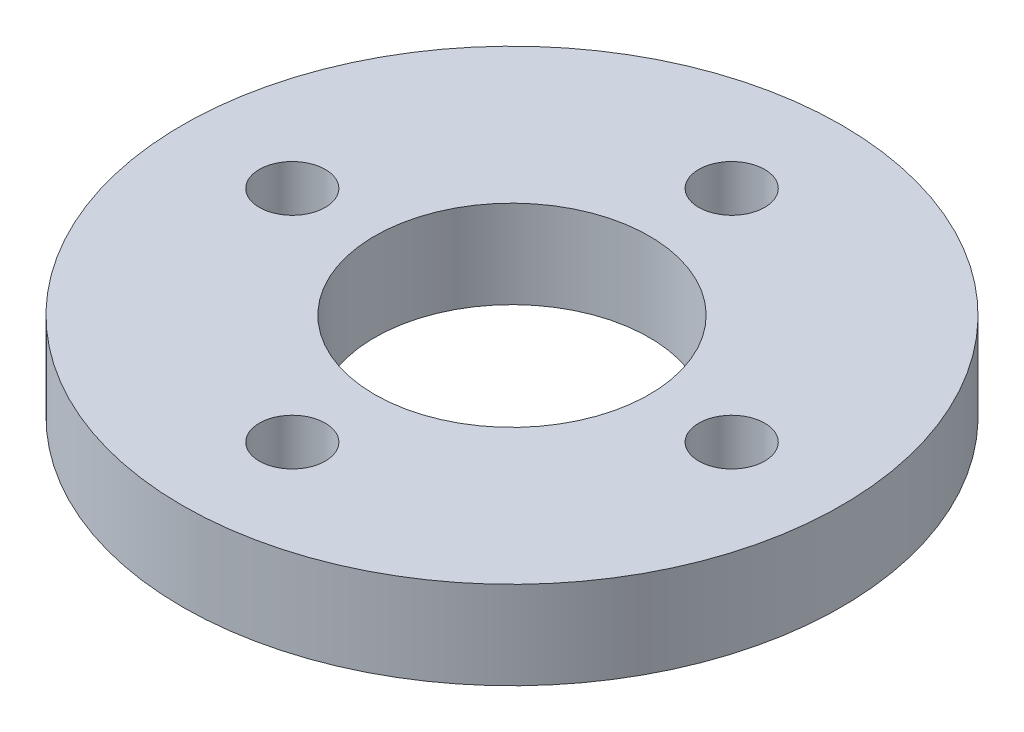
ISO-10303-21;
HEADER;
FILE_DESCRIPTION(('STEP AP214'),'2;1');
FILE_NAME('part.step','',(''),(''),'','','');
FILE_SCHEMA(('AUTOMOTIVE_DESIGN { 1 0 10303 214 1 1 1 1 }'));
ENDSEC;
DATA;
#1=APPLICATION_CONTEXT('core data for automotive mechanical design processes');
#2=APPLICATION_PROTOCOL_DEFINITION('international standard','automotive_design',2000,#1);
#3=PRODUCT_CONTEXT('',#1,'mechanical');
#4=PRODUCT('Part','Part','',(#3));
#5=PRODUCT_RELATED_PRODUCT_CATEGORY('part','',(#4));
#6=PRODUCT_DEFINITION_FORMATION('','',#4);
#7=PRODUCT_DEFINITION_CONTEXT('part definition',#1,'design');
#8=PRODUCT_DEFINITION('design','',#6,#7);
#9=PRODUCT_DEFINITION_SHAPE('','',#8);
#10=(LENGTH_UNIT() NAMED_UNIT(*) SI_UNIT(.MILLI.,.METRE.));
#11=(NAMED_UNIT(*) PLANE_ANGLE_UNIT() SI_UNIT($,.RADIAN.));
#12=(NAMED_UNIT(*) SI_UNIT($,.STERADIAN.) SOLID_ANGLE_UNIT());
#13=UNCERTAINTY_MEASURE_WITH_UNIT(LENGTH_MEASURE(1.E-05),#10,'distance_accuracy_value','');
#14=(GEOMETRIC_REPRESENTATION_CONTEXT(3) GLOBAL_UNCERTAINTY_ASSIGNED_CONTEXT((#13)) GLOBAL_UNIT_ASSIGNED_CONTEXT((#10,
#11,#12)) REPRESENTATION_CONTEXT('',''));
#15=CARTESIAN_POINT('',(0.,0.,0.));
#16=DIRECTION('',(0.,0.,1.));
#17=DIRECTION('',(1.,0.,0.));
#18=AXIS2_PLACEMENT_3D('',#15,#16,#17);
#19=CARTESIAN_POINT('',(0.,4.,0.));
#20=DIRECTION('',(0.,1.,0.));
#21=DIRECTION('',(0.,0.,1.));
#22=AXIS2_PLACEMENT_3D('',#19,#20,#21);
#23=PLANE('',#22);
#24=CARTESIAN_POINT('',(0.,4.,10.));
#25=DIRECTION('',(0.,1.,0.));
#26=DIRECTION('',(0.,0.,1.));
#27=AXIS2_PLACEMENT_3D('',#24,#25,#26);
#28=CIRCLE('',#27,1.5);
#29=CARTESIAN_POINT('',(0.,4.,11.5));
#30=VERTEX_POINT('',#29);
#31=EDGE_CURVE('E64',#30,#30,#28,.T.);
#32=ORIENTED_EDGE('',*,*,#31,.F.);
#33=EDGE_LOOP('',(#32));
#34=FACE_BOUND('',#33,.T.);
#35=CARTESIAN_POINT('',(0.,4.,-10.));
#36=DIRECTION('',(0.,1.,0.));
#37=DIRECTION('',(0.,0.,1.));
#38=AXIS2_PLACEMENT_3D('',#35,#36,#37);
#39=CIRCLE('',#38,1.5);
#40=CARTESIAN_POINT('',(0.,4.,-8.5));
#41=VERTEX_POINT('',#40);
#42=EDGE_CURVE('E52',#41,#41,#39,.T.);
#43=ORIENTED_EDGE('',*,*,#42,.F.);
#44=EDGE_LOOP('',(#43));
#45=FACE_BOUND('',#44,.T.);
#46=CARTESIAN_POINT('',(0.,4.,0.));
#47=DIRECTION('',(0.,1.,0.));
#48=DIRECTION('',(0.,0.,1.));
#49=AXIS2_PLACEMENT_3D('',#46,#47,#48);
#50=CIRCLE('',#49,15.);
#51=CARTESIAN_POINT('',(0.,4.,15.));
#52=VERTEX_POINT('',#51);
#53=EDGE_CURVE('E10',#52,#52,#50,.T.);
#54=ORIENTED_EDGE('',*,*,#53,.T.);
#55=EDGE_LOOP('',(#54));
#56=FACE_BOUND('',#55,.T.);
#57=CARTESIAN_POINT('',(0.,4.,0.));
#58=DIRECTION('',(0.,1.,0.));
#59=DIRECTION('',(0.,0.,1.));
#60=AXIS2_PLACEMENT_3D('',#57,#58,#59);
#61=CIRCLE('',#60,6.25);
#62=CARTESIAN_POINT('',(0.,4.,6.25));
#63=VERTEX_POINT('',#62);
#64=EDGE_CURVE('E47',#63,#63,#61,.T.);
#65=ORIENTED_EDGE('',*,*,#64,.F.);
#66=EDGE_LOOP('',(#65));
#67=FACE_BOUND('',#66,.T.);
#68=CARTESIAN_POINT('',(10.,4.,0.));
#69=DIRECTION('',(0.,1.,0.));
#70=DIRECTION('',(0.,0.,1.));
#71=AXIS2_PLACEMENT_3D('',#68,#69,#70);
#72=CIRCLE('',#71,1.5);
#73=CARTESIAN_POINT('',(10.,4.,1.50000000000003));
#74=VERTEX_POINT('',#73);
#75=EDGE_CURVE('E58',#74,#74,#72,.T.);
#76=ORIENTED_EDGE('',*,*,#75,.F.);
#77=EDGE_LOOP('',(#76));
#78=FACE_BOUND('',#77,.T.);
#79=CARTESIAN_POINT('',(-10.,4.,-1.04744440165294E-13));
#80=DIRECTION('',(0.,1.,0.));
#81=DIRECTION('',(0.,0.,1.));
#82=AXIS2_PLACEMENT_3D('',#79,#80,#81);
#83=CIRCLE('',#82,1.5);
#84=CARTESIAN_POINT('',(-10.,4.,1.49999999999989));
#85=VERTEX_POINT('',#84);
#86=EDGE_CURVE('E70',#85,#85,#83,.T.);
#87=ORIENTED_EDGE('',*,*,#86,.F.);
#88=EDGE_LOOP('',(#87));
#89=FACE_BOUND('',#88,.T.);
#90=ADVANCED_FACE('F36',(#34,#45,#56,#67,#78,#89),#23,.T.);
#91=CARTESIAN_POINT('',(0.,0.,0.));
#92=DIRECTION('',(0.,1.,0.));
#93=DIRECTION('',(0.,0.,1.));
#94=AXIS2_PLACEMENT_3D('',#91,#92,#93);
#95=PLANE('',#94);
#96=CARTESIAN_POINT('',(0.,0.,0.));
#97=DIRECTION('',(0.,1.,0.));
#98=DIRECTION('',(0.,0.,1.));
#99=AXIS2_PLACEMENT_3D('',#96,#97,#98);
#100=CIRCLE('',#99,15.);
#101=CARTESIAN_POINT('',(0.,0.,15.));
#102=VERTEX_POINT('',#101);
#103=EDGE_CURVE('E40',#102,#102,#100,.T.);
#104=ORIENTED_EDGE('',*,*,#103,.F.);
#105=EDGE_LOOP('',(#104));
#106=FACE_BOUND('',#105,.T.);
#107=CARTESIAN_POINT('',(0.,0.,0.));
#108=DIRECTION('',(0.,1.,0.));
#109=DIRECTION('',(0.,0.,1.));
#110=AXIS2_PLACEMENT_3D('',#107,#108,#109);
#111=CIRCLE('',#110,6.25);
#112=CARTESIAN_POINT('',(0.,0.,6.25));
#113=VERTEX_POINT('',#112);
#114=EDGE_CURVE('E49',#113,#113,#111,.T.);
#115=ORIENTED_EDGE('',*,*,#114,.T.);
#116=EDGE_LOOP('',(#115));
#117=FACE_BOUND('',#116,.T.);
#118=CARTESIAN_POINT('',(0.,0.,-10.));
#119=DIRECTION('',(0.,1.,0.));
#120=DIRECTION('',(0.,0.,1.));
#121=AXIS2_PLACEMENT_3D('',#118,#119,#120);
#122=CIRCLE('',#121,1.5);
#123=CARTESIAN_POINT('',(0.,0.,-8.5));
#124=VERTEX_POINT('',#123);
#125=EDGE_CURVE('E55',#124,#124,#122,.T.);
#126=ORIENTED_EDGE('',*,*,#125,.T.);
#127=EDGE_LOOP('',(#126));
#128=FACE_BOUND('',#127,.T.);
#129=CARTESIAN_POINT('',(10.,0.,0.));
#130=DIRECTION('',(0.,1.,0.));
#131=DIRECTION('',(0.,0.,1.));
#132=AXIS2_PLACEMENT_3D('',#129,#130,#131);
#133=CIRCLE('',#132,1.5);
#134=CARTESIAN_POINT('',(10.,0.,1.50000000000003));
#135=VERTEX_POINT('',#134);
#136=EDGE_CURVE('E61',#135,#135,#133,.T.);
#137=ORIENTED_EDGE('',*,*,#136,.T.);
#138=EDGE_LOOP('',(#137));
#139=FACE_BOUND('',#138,.T.);
#140=CARTESIAN_POINT('',(0.,0.,10.));
#141=DIRECTION('',(0.,1.,0.));
#142=DIRECTION('',(0.,0.,1.));
#143=AXIS2_PLACEMENT_3D('',#140,#141,#142);
#144=CIRCLE('',#143,1.5);
#145=CARTESIAN_POINT('',(0.,0.,11.5));
#146=VERTEX_POINT('',#145);
#147=EDGE_CURVE('E67',#146,#146,#144,.T.);
#148=ORIENTED_EDGE('',*,*,#147,.T.);
#149=EDGE_LOOP('',(#148));
#150=FACE_BOUND('',#149,.T.);
#151=CARTESIAN_POINT('',(-10.,0.,-1.04744440165294E-13));
#152=DIRECTION('',(0.,1.,0.));
#153=DIRECTION('',(0.,0.,1.));
#154=AXIS2_PLACEMENT_3D('',#151,#152,#153);
#155=CIRCLE('',#154,1.5);
#156=CARTESIAN_POINT('',(-10.,0.,1.49999999999989));
#157=VERTEX_POINT('',#156);
#158=EDGE_CURVE('E73',#157,#157,#155,.T.);
#159=ORIENTED_EDGE('',*,*,#158,.T.);
#160=EDGE_LOOP('',(#159));
#161=FACE_BOUND('',#160,.T.);
#162=ADVANCED_FACE('F83',(#106,#117,#128,#139,#150,#161),#95,.F.);
#163=CARTESIAN_POINT('',(0.,4.,0.));
#164=DIRECTION('',(0.,-1.,0.));
#165=DIRECTION('',(0.,0.,-1.));
#166=AXIS2_PLACEMENT_3D('',#163,#164,#165);
#167=CYLINDRICAL_SURFACE('',#166,15.);
#168=ORIENTED_EDGE('',*,*,#53,.F.);
#169=EDGE_LOOP('',(#168));
#170=FACE_BOUND('',#169,.T.);
#171=ORIENTED_EDGE('',*,*,#103,.T.);
#172=EDGE_LOOP('',(#171));
#173=FACE_BOUND('',#172,.T.);
#174=ADVANCED_FACE('F38',(#170,#173),#167,.T.);
#175=CARTESIAN_POINT('',(0.,4.,0.));
#176=DIRECTION('',(0.,-1.,0.));
#177=DIRECTION('',(0.,0.,-1.));
#178=AXIS2_PLACEMENT_3D('',#175,#176,#177);
#179=CYLINDRICAL_SURFACE('',#178,6.25);
#180=ORIENTED_EDGE('',*,*,#64,.T.);
#181=EDGE_LOOP('',(#180));
#182=FACE_BOUND('',#181,.T.);
#183=ORIENTED_EDGE('',*,*,#114,.F.);
#184=EDGE_LOOP('',(#183));
#185=FACE_BOUND('',#184,.T.);
#186=ADVANCED_FACE('F93',(#182,#185),#179,.F.);
#187=CARTESIAN_POINT('',(0.,4.,-10.));
#188=DIRECTION('',(0.,-1.,0.));
#189=DIRECTION('',(0.,0.,-1.));
#190=AXIS2_PLACEMENT_3D('',#187,#188,#189);
#191=CYLINDRICAL_SURFACE('',#190,1.5);
#192=ORIENTED_EDGE('',*,*,#42,.T.);
#193=EDGE_LOOP('',(#192));
#194=FACE_BOUND('',#193,.T.);
#195=ORIENTED_EDGE('',*,*,#125,.F.);
#196=EDGE_LOOP('',(#195));
#197=FACE_BOUND('',#196,.T.);
#198=ADVANCED_FACE('F96',(#194,#197),#191,.F.);
#199=CARTESIAN_POINT('',(10.,4.,0.));
#200=DIRECTION('',(0.,-1.,0.));
#201=DIRECTION('',(0.,0.,-1.));
#202=AXIS2_PLACEMENT_3D('',#199,#200,#201);
#203=CYLINDRICAL_SURFACE('',#202,1.5);
#204=ORIENTED_EDGE('',*,*,#75,.T.);
#205=EDGE_LOOP('',(#204));
#206=FACE_BOUND('',#205,.T.);
#207=ORIENTED_EDGE('',*,*,#136,.F.);
#208=EDGE_LOOP('',(#207));
#209=FACE_BOUND('',#208,.T.);
#210=ADVANCED_FACE('F100',(#206,#209),#203,.F.);
#211=CARTESIAN_POINT('',(0.,4.,10.));
#212=DIRECTION('',(0.,-1.,0.));
#213=DIRECTION('',(0.,0.,-1.));
#214=AXIS2_PLACEMENT_3D('',#211,#212,#213);
#215=CYLINDRICAL_SURFACE('',#214,1.5);
#216=ORIENTED_EDGE('',*,*,#31,.T.);
#217=EDGE_LOOP('',(#216));
#218=FACE_BOUND('',#217,.T.);
#219=ORIENTED_EDGE('',*,*,#147,.F.);
#220=EDGE_LOOP('',(#219));
#221=FACE_BOUND('',#220,.T.);
#222=ADVANCED_FACE('F104',(#218,#221),#215,.F.);
#223=CARTESIAN_POINT('',(-10.,4.,-1.04744440165294E-13));
#224=DIRECTION('',(0.,-1.,0.));
#225=DIRECTION('',(0.,0.,-1.));
#226=AXIS2_PLACEMENT_3D('',#223,#224,#225);
#227=CYLINDRICAL_SURFACE('',#226,1.5);
#228=ORIENTED_EDGE('',*,*,#86,.T.);
#229=EDGE_LOOP('',(#228));
#230=FACE_BOUND('',#229,.T.);
#231=ORIENTED_EDGE('',*,*,#158,.F.);
#232=EDGE_LOOP('',(#231));
#233=FACE_BOUND('',#232,.T.);
#234=ADVANCED_FACE('F79',(#230,#233),#227,.F.);
#235=CLOSED_SHELL('',(#90,#162,#174,#186,#198,#210,#222,#234));
#236=MANIFOLD_SOLID_BREP('B2',#235);
#237=ADVANCED_BREP_SHAPE_REPRESENTATION('',(#18,#236),#14);
#238=SHAPE_DEFINITION_REPRESENTATION(#9,#237);
ENDSEC;
END-ISO-10303-21;
